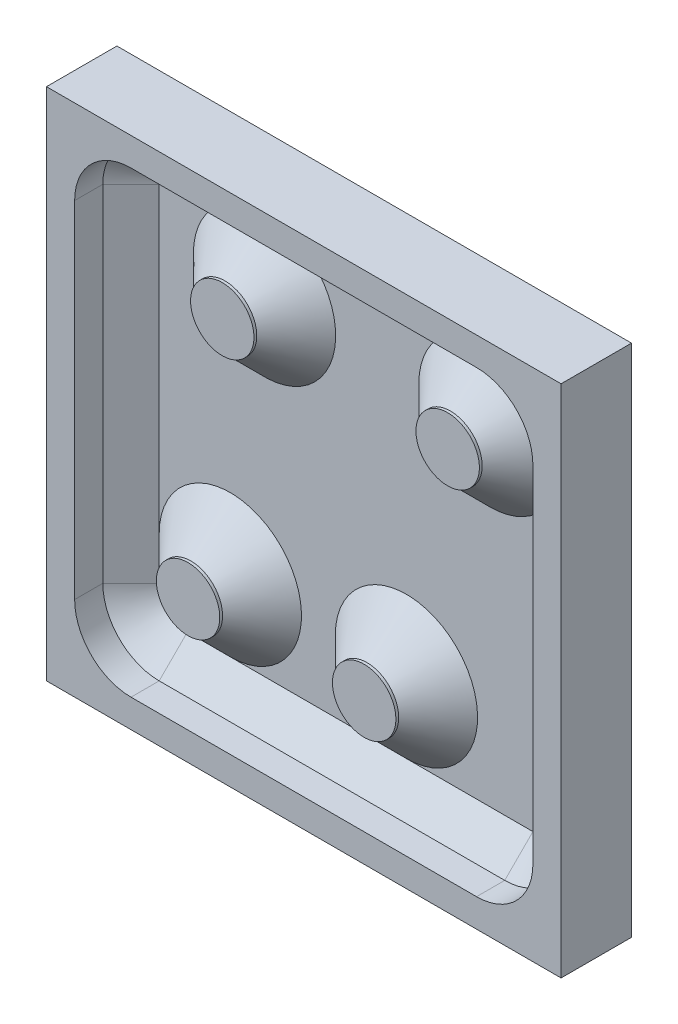
ISO-10303-21;
HEADER;
FILE_DESCRIPTION(('STEP AP214'),'2;1');
FILE_NAME('part.step','',(''),(''),'','','');
FILE_SCHEMA(('AUTOMOTIVE_DESIGN { 1 0 10303 214 1 1 1 1 }'));
ENDSEC;
DATA;
#1=APPLICATION_CONTEXT('core data for automotive mechanical design processes');
#2=APPLICATION_PROTOCOL_DEFINITION('international standard','automotive_design',2000,#1);
#3=PRODUCT_CONTEXT('',#1,'mechanical');
#4=PRODUCT('Part','Part','',(#3));
#5=PRODUCT_RELATED_PRODUCT_CATEGORY('part','',(#4));
#6=PRODUCT_DEFINITION_FORMATION('','',#4);
#7=PRODUCT_DEFINITION_CONTEXT('part definition',#1,'design');
#8=PRODUCT_DEFINITION('design','',#6,#7);
#9=PRODUCT_DEFINITION_SHAPE('','',#8);
#10=(LENGTH_UNIT() NAMED_UNIT(*) SI_UNIT(.MILLI.,.METRE.));
#11=(NAMED_UNIT(*) PLANE_ANGLE_UNIT() SI_UNIT($,.RADIAN.));
#12=(NAMED_UNIT(*) SI_UNIT($,.STERADIAN.) SOLID_ANGLE_UNIT());
#13=UNCERTAINTY_MEASURE_WITH_UNIT(LENGTH_MEASURE(1.E-05),#10,'distance_accuracy_value','');
#14=(GEOMETRIC_REPRESENTATION_CONTEXT(3) GLOBAL_UNCERTAINTY_ASSIGNED_CONTEXT((#13)) GLOBAL_UNIT_ASSIGNED_CONTEXT((#10,
#11,#12)) REPRESENTATION_CONTEXT('',''));
#15=CARTESIAN_POINT('',(0.,0.,0.));
#16=DIRECTION('',(0.,0.,1.));
#17=DIRECTION('',(1.,0.,0.));
#18=AXIS2_PLACEMENT_3D('',#15,#16,#17);
#19=CARTESIAN_POINT('',(-18.2634559672906,-18.2634559672906,-5.));
#20=DIRECTION('',(-1.,0.,0.));
#21=DIRECTION('',(0.,0.,1.));
#22=AXIS2_PLACEMENT_3D('',#19,#20,#21);
#23=PLANE('',#22);
#24=DIRECTION('',(0.,-1.,0.));
#25=VECTOR('',#24,1.);
#26=CARTESIAN_POINT('',(-18.2634559672906,-18.2634559672906,0.));
#27=LINE('',#26,#25);
#28=CARTESIAN_POINT('',(-18.2634559672906,18.2634559672906,0.));
#29=VERTEX_POINT('',#28);
#30=CARTESIAN_POINT('',(-18.2634559672906,-18.2634559672906,0.));
#31=VERTEX_POINT('',#30);
#32=EDGE_CURVE('E313',#29,#31,#27,.T.);
#33=ORIENTED_EDGE('',*,*,#32,.F.);
#34=DIRECTION('',(0.,0.,1.));
#35=VECTOR('',#34,1.);
#36=CARTESIAN_POINT('',(-18.2634559672906,18.2634559672906,-5.));
#37=LINE('',#36,#35);
#38=CARTESIAN_POINT('',(-18.2634559672906,18.2634559672906,-5.));
#39=VERTEX_POINT('',#38);
#40=EDGE_CURVE('E11',#39,#29,#37,.T.);
#41=ORIENTED_EDGE('',*,*,#40,.F.);
#42=DIRECTION('',(0.,-1.,0.));
#43=VECTOR('',#42,1.);
#44=CARTESIAN_POINT('',(-18.2634559672906,-18.2634559672906,-5.));
#45=LINE('',#44,#43);
#46=CARTESIAN_POINT('',(-18.2634559672906,-18.2634559672906,-5.));
#47=VERTEX_POINT('',#46);
#48=EDGE_CURVE('E314',#39,#47,#45,.T.);
#49=ORIENTED_EDGE('',*,*,#48,.T.);
#50=DIRECTION('',(0.,0.,1.));
#51=VECTOR('',#50,1.);
#52=CARTESIAN_POINT('',(-18.2634559672906,-18.2634559672906,-5.));
#53=LINE('',#52,#51);
#54=EDGE_CURVE('E38',#47,#31,#53,.T.);
#55=ORIENTED_EDGE('',*,*,#54,.T.);
#56=EDGE_LOOP('',(#33,#41,#49,#55));
#57=FACE_BOUND('',#56,.T.);
#58=ADVANCED_FACE('F35',(#57),#23,.T.);
#59=CARTESIAN_POINT('',(18.2634559672906,18.2634559672906,-5.));
#60=DIRECTION('',(0.,1.,0.));
#61=DIRECTION('',(0.,0.,1.));
#62=AXIS2_PLACEMENT_3D('',#59,#60,#61);
#63=PLANE('',#62);
#64=DIRECTION('',(-1.,0.,0.));
#65=VECTOR('',#64,1.);
#66=CARTESIAN_POINT('',(18.2634559672906,18.2634559672906,0.));
#67=LINE('',#66,#65);
#68=CARTESIAN_POINT('',(18.2634559672906,18.2634559672906,0.));
#69=VERTEX_POINT('',#68);
#70=EDGE_CURVE('E317',#69,#29,#67,.T.);
#71=ORIENTED_EDGE('',*,*,#70,.F.);
#72=DIRECTION('',(0.,0.,1.));
#73=VECTOR('',#72,1.);
#74=CARTESIAN_POINT('',(18.2634559672906,18.2634559672906,-5.));
#75=LINE('',#74,#73);
#76=CARTESIAN_POINT('',(18.2634559672906,18.2634559672906,-5.));
#77=VERTEX_POINT('',#76);
#78=EDGE_CURVE('E43',#77,#69,#75,.T.);
#79=ORIENTED_EDGE('',*,*,#78,.F.);
#80=DIRECTION('',(-1.,0.,0.));
#81=VECTOR('',#80,1.);
#82=CARTESIAN_POINT('',(18.2634559672906,18.2634559672906,-5.));
#83=LINE('',#82,#81);
#84=EDGE_CURVE('E322',#77,#39,#83,.T.);
#85=ORIENTED_EDGE('',*,*,#84,.T.);
#86=ORIENTED_EDGE('',*,*,#40,.T.);
#87=EDGE_LOOP('',(#71,#79,#85,#86));
#88=FACE_BOUND('',#87,.T.);
#89=ADVANCED_FACE('F337',(#88),#63,.T.);
#90=CARTESIAN_POINT('',(18.2634559672906,-18.2634559672906,-5.));
#91=DIRECTION('',(1.,0.,0.));
#92=DIRECTION('',(0.,0.,-1.));
#93=AXIS2_PLACEMENT_3D('',#90,#91,#92);
#94=PLANE('',#93);
#95=DIRECTION('',(0.,1.,0.));
#96=VECTOR('',#95,1.);
#97=CARTESIAN_POINT('',(18.2634559672906,-18.2634559672906,0.));
#98=LINE('',#97,#96);
#99=CARTESIAN_POINT('',(18.2634559672906,-18.2634559672906,0.));
#100=VERTEX_POINT('',#99);
#101=EDGE_CURVE('E329',#100,#69,#98,.T.);
#102=ORIENTED_EDGE('',*,*,#101,.F.);
#103=DIRECTION('',(0.,0.,1.));
#104=VECTOR('',#103,1.);
#105=CARTESIAN_POINT('',(18.2634559672906,-18.2634559672906,-5.));
#106=LINE('',#105,#104);
#107=CARTESIAN_POINT('',(18.2634559672906,-18.2634559672906,-5.));
#108=VERTEX_POINT('',#107);
#109=EDGE_CURVE('E334',#108,#100,#106,.T.);
#110=ORIENTED_EDGE('',*,*,#109,.F.);
#111=DIRECTION('',(0.,1.,0.));
#112=VECTOR('',#111,1.);
#113=CARTESIAN_POINT('',(18.2634559672906,-18.2634559672906,-5.));
#114=LINE('',#113,#112);
#115=EDGE_CURVE('E319',#108,#77,#114,.T.);
#116=ORIENTED_EDGE('',*,*,#115,.T.);
#117=ORIENTED_EDGE('',*,*,#78,.T.);
#118=EDGE_LOOP('',(#102,#110,#116,#117));
#119=FACE_BOUND('',#118,.T.);
#120=ADVANCED_FACE('F341',(#119),#94,.T.);
#121=CARTESIAN_POINT('',(18.2634559672906,-18.2634559672906,-5.));
#122=DIRECTION('',(0.,-1.,0.));
#123=DIRECTION('',(0.,0.,-1.));
#124=AXIS2_PLACEMENT_3D('',#121,#122,#123);
#125=PLANE('',#124);
#126=DIRECTION('',(1.,0.,0.));
#127=VECTOR('',#126,1.);
#128=CARTESIAN_POINT('',(18.2634559672906,-18.2634559672906,0.));
#129=LINE('',#128,#127);
#130=EDGE_CURVE('E326',#31,#100,#129,.T.);
#131=ORIENTED_EDGE('',*,*,#130,.F.);
#132=ORIENTED_EDGE('',*,*,#54,.F.);
#133=DIRECTION('',(1.,0.,0.));
#134=VECTOR('',#133,1.);
#135=CARTESIAN_POINT('',(18.2634559672906,-18.2634559672906,-5.));
#136=LINE('',#135,#134);
#137=EDGE_CURVE('E316',#47,#108,#136,.T.);
#138=ORIENTED_EDGE('',*,*,#137,.T.);
#139=ORIENTED_EDGE('',*,*,#109,.T.);
#140=EDGE_LOOP('',(#131,#132,#138,#139));
#141=FACE_BOUND('',#140,.T.);
#142=ADVANCED_FACE('F336',(#141),#125,.T.);
#143=CARTESIAN_POINT('',(0.,0.,-5.));
#144=DIRECTION('',(0.,0.,1.));
#145=DIRECTION('',(1.,0.,0.));
#146=AXIS2_PLACEMENT_3D('',#143,#144,#145);
#147=PLANE('',#146);
#148=ORIENTED_EDGE('',*,*,#48,.F.);
#149=ORIENTED_EDGE('',*,*,#84,.F.);
#150=ORIENTED_EDGE('',*,*,#115,.F.);
#151=ORIENTED_EDGE('',*,*,#137,.F.);
#152=EDGE_LOOP('',(#148,#149,#150,#151));
#153=FACE_BOUND('',#152,.T.);
#154=ADVANCED_FACE('F343',(#153),#147,.F.);
#155=CARTESIAN_POINT('',(0.,0.,0.));
#156=DIRECTION('',(0.,0.,1.));
#157=DIRECTION('',(1.,0.,0.));
#158=AXIS2_PLACEMENT_3D('',#155,#156,#157);
#159=PLANE('',#158);
#160=CARTESIAN_POINT('',(-12.2634559672906,-12.2634559672906,0.));
#161=DIRECTION('',(0.,0.,-1.));
#162=DIRECTION('',(-1.,0.,0.));
#163=AXIS2_PLACEMENT_3D('',#160,#161,#162);
#164=CIRCLE('',#163,4.);
#165=CARTESIAN_POINT('',(-16.2634559672906,-12.2634559672906,0.));
#166=VERTEX_POINT('',#165);
#167=CARTESIAN_POINT('',(-12.2634559672906,-16.2634559672906,0.));
#168=VERTEX_POINT('',#167);
#169=EDGE_CURVE('E201',#166,#168,#164,.F.);
#170=ORIENTED_EDGE('',*,*,#169,.F.);
#171=DIRECTION('',(0.,1.,0.));
#172=VECTOR('',#171,1.);
#173=CARTESIAN_POINT('',(-16.2634559672906,-16.2634559672906,0.));
#174=LINE('',#173,#172);
#175=CARTESIAN_POINT('',(-16.2634559672906,12.2634559672906,0.));
#176=VERTEX_POINT('',#175);
#177=EDGE_CURVE('E195',#166,#176,#174,.T.);
#178=ORIENTED_EDGE('',*,*,#177,.T.);
#179=CARTESIAN_POINT('',(-12.2634559672906,12.2634559672906,0.));
#180=DIRECTION('',(0.,0.,-1.));
#181=DIRECTION('',(-1.,0.,0.));
#182=AXIS2_PLACEMENT_3D('',#179,#180,#181);
#183=CIRCLE('',#182,4.);
#184=CARTESIAN_POINT('',(-12.2634559672906,16.2634559672906,0.));
#185=VERTEX_POINT('',#184);
#186=EDGE_CURVE('E205',#185,#176,#183,.F.);
#187=ORIENTED_EDGE('',*,*,#186,.F.);
#188=DIRECTION('',(1.,0.,0.));
#189=VECTOR('',#188,1.);
#190=CARTESIAN_POINT('',(-16.2634559672906,16.2634559672906,0.));
#191=LINE('',#190,#189);
#192=CARTESIAN_POINT('',(12.2634559672906,16.2634559672906,0.));
#193=VERTEX_POINT('',#192);
#194=EDGE_CURVE('E703',#185,#193,#191,.T.);
#195=ORIENTED_EDGE('',*,*,#194,.T.);
#196=CARTESIAN_POINT('',(12.2634559672906,12.2634559672906,0.));
#197=DIRECTION('',(0.,0.,-1.));
#198=DIRECTION('',(-1.,0.,0.));
#199=AXIS2_PLACEMENT_3D('',#196,#197,#198);
#200=CIRCLE('',#199,4.);
#201=CARTESIAN_POINT('',(16.2634559672906,12.2634559672906,0.));
#202=VERTEX_POINT('',#201);
#203=EDGE_CURVE('E185',#202,#193,#200,.F.);
#204=ORIENTED_EDGE('',*,*,#203,.F.);
#205=DIRECTION('',(0.,-1.,0.));
#206=VECTOR('',#205,1.);
#207=CARTESIAN_POINT('',(16.2634559672906,-16.2634559672906,0.));
#208=LINE('',#207,#206);
#209=CARTESIAN_POINT('',(16.2634559672906,-12.2634559672906,0.));
#210=VERTEX_POINT('',#209);
#211=EDGE_CURVE('E51',#202,#210,#208,.T.);
#212=ORIENTED_EDGE('',*,*,#211,.T.);
#213=CARTESIAN_POINT('',(12.2634559672906,-12.2634559672906,0.));
#214=DIRECTION('',(0.,0.,-1.));
#215=DIRECTION('',(-1.,0.,0.));
#216=AXIS2_PLACEMENT_3D('',#213,#214,#215);
#217=CIRCLE('',#216,4.);
#218=CARTESIAN_POINT('',(12.2634559672906,-16.2634559672906,0.));
#219=VERTEX_POINT('',#218);
#220=EDGE_CURVE('E180',#219,#210,#217,.F.);
#221=ORIENTED_EDGE('',*,*,#220,.F.);
#222=DIRECTION('',(-1.,0.,0.));
#223=VECTOR('',#222,1.);
#224=CARTESIAN_POINT('',(-16.2634559672906,-16.2634559672906,0.));
#225=LINE('',#224,#223);
#226=EDGE_CURVE('E190',#219,#168,#225,.T.);
#227=ORIENTED_EDGE('',*,*,#226,.T.);
#228=EDGE_LOOP('',(#170,#178,#187,#195,#204,#212,#221,#227));
#229=FACE_BOUND('',#228,.T.);
#230=ORIENTED_EDGE('',*,*,#32,.T.);
#231=ORIENTED_EDGE('',*,*,#130,.T.);
#232=ORIENTED_EDGE('',*,*,#101,.T.);
#233=ORIENTED_EDGE('',*,*,#70,.T.);
#234=EDGE_LOOP('',(#230,#231,#232,#233));
#235=FACE_BOUND('',#234,.T.);
#236=ADVANCED_FACE('F197',(#229,#235),#159,.T.);
#237=CARTESIAN_POINT('',(0.,0.,-4.));
#238=DIRECTION('',(0.,0.,-1.));
#239=DIRECTION('',(-1.,0.,0.));
#240=AXIS2_PLACEMENT_3D('',#237,#238,#239);
#241=PLANE('',#240);
#242=DIRECTION('',(0.,1.,0.));
#243=VECTOR('',#242,1.);
#244=CARTESIAN_POINT('',(-14.2634559672906,12.2634559672906,-4.));
#245=LINE('',#244,#243);
#246=CARTESIAN_POINT('',(-14.2634559672906,-12.2634559672906,-4.));
#247=VERTEX_POINT('',#246);
#248=CARTESIAN_POINT('',(-14.2634559672906,-9.21345596729061,-4.));
#249=VERTEX_POINT('',#248);
#250=EDGE_CURVE('E234',#247,#249,#245,.T.);
#251=ORIENTED_EDGE('',*,*,#250,.F.);
#252=CARTESIAN_POINT('',(-12.2634559672906,-12.2634559672906,-4.));
#253=DIRECTION('',(0.,0.,-1.));
#254=DIRECTION('',(-1.,0.,0.));
#255=AXIS2_PLACEMENT_3D('',#252,#253,#254);
#256=CIRCLE('',#255,2.00000000000001);
#257=CARTESIAN_POINT('',(-12.2634559672906,-14.2634559672906,-4.));
#258=VERTEX_POINT('',#257);
#259=EDGE_CURVE('E239',#258,#247,#256,.T.);
#260=ORIENTED_EDGE('',*,*,#259,.F.);
#261=DIRECTION('',(-1.,0.,0.));
#262=VECTOR('',#261,1.);
#263=CARTESIAN_POINT('',(-12.2634559672906,-14.2634559672906,-4.));
#264=LINE('',#263,#262);
#265=CARTESIAN_POINT('',(-9.21345596729061,-14.2634559672906,-4.));
#266=VERTEX_POINT('',#265);
#267=EDGE_CURVE('E241',#266,#258,#264,.T.);
#268=ORIENTED_EDGE('',*,*,#267,.F.);
#269=CARTESIAN_POINT('',(-9.21345596729061,-9.21345596729061,-4.));
#270=DIRECTION('',(0.,0.,-1.));
#271=DIRECTION('',(-1.,0.,0.));
#272=AXIS2_PLACEMENT_3D('',#269,#270,#271);
#273=CIRCLE('',#272,5.05000000000002);
#274=EDGE_CURVE('E295',#249,#266,#273,.F.);
#275=ORIENTED_EDGE('',*,*,#274,.F.);
#276=EDGE_LOOP('',(#251,#260,#268,#275));
#277=FACE_BOUND('',#276,.T.);
#278=ADVANCED_FACE('F350',(#277),#241,.F.);
#279=DIRECTION('',(0.,-1.,0.));
#280=VECTOR('',#279,1.);
#281=CARTESIAN_POINT('',(14.2634559672906,-12.2634559672906,-4.));
#282=LINE('',#281,#280);
#283=CARTESIAN_POINT('',(14.2634559672906,12.2634559672906,-4.));
#284=VERTEX_POINT('',#283);
#285=CARTESIAN_POINT('',(14.2634559672906,9.21345596729061,-4.));
#286=VERTEX_POINT('',#285);
#287=EDGE_CURVE('E230',#284,#286,#282,.T.);
#288=ORIENTED_EDGE('',*,*,#287,.F.);
#289=CARTESIAN_POINT('',(12.2634559672906,12.2634559672906,-4.));
#290=DIRECTION('',(0.,0.,-1.));
#291=DIRECTION('',(-1.,0.,0.));
#292=AXIS2_PLACEMENT_3D('',#289,#290,#291);
#293=CIRCLE('',#292,2.00000000000001);
#294=CARTESIAN_POINT('',(12.2634559672906,14.2634559672906,-4.));
#295=VERTEX_POINT('',#294);
#296=EDGE_CURVE('E224',#295,#284,#293,.T.);
#297=ORIENTED_EDGE('',*,*,#296,.F.);
#298=DIRECTION('',(1.,0.,0.));
#299=VECTOR('',#298,1.);
#300=CARTESIAN_POINT('',(12.2634559672906,14.2634559672906,-4.));
#301=LINE('',#300,#299);
#302=CARTESIAN_POINT('',(9.21345596729061,14.2634559672906,-4.));
#303=VERTEX_POINT('',#302);
#304=EDGE_CURVE('E220',#303,#295,#301,.T.);
#305=ORIENTED_EDGE('',*,*,#304,.F.);
#306=CARTESIAN_POINT('',(9.21345596729061,9.21345596729061,-4.));
#307=DIRECTION('',(0.,0.,-1.));
#308=DIRECTION('',(-1.,0.,0.));
#309=AXIS2_PLACEMENT_3D('',#306,#307,#308);
#310=CIRCLE('',#309,5.05000000000001);
#311=EDGE_CURVE('E290',#286,#303,#310,.F.);
#312=ORIENTED_EDGE('',*,*,#311,.F.);
#313=EDGE_LOOP('',(#288,#297,#305,#312));
#314=FACE_BOUND('',#313,.T.);
#315=ADVANCED_FACE('F387',(#314),#241,.F.);
#316=CARTESIAN_POINT('',(16.2634559672906,-16.2634559672906,-4.));
#317=DIRECTION('',(-1.,0.,0.));
#318=DIRECTION('',(0.,0.,1.));
#319=AXIS2_PLACEMENT_3D('',#316,#317,#318);
#320=PLANE('',#319);
#321=DIRECTION('',(0.,0.,1.));
#322=VECTOR('',#321,1.);
#323=CARTESIAN_POINT('',(16.2634559672906,-12.2634559672906,-4.));
#324=LINE('',#323,#322);
#325=CARTESIAN_POINT('',(16.2634559672906,-12.2634559672906,-2.));
#326=VERTEX_POINT('',#325);
#327=EDGE_CURVE('E203',#210,#326,#324,.F.);
#328=ORIENTED_EDGE('',*,*,#327,.F.);
#329=ORIENTED_EDGE('',*,*,#211,.F.);
#330=DIRECTION('',(0.,0.,1.));
#331=VECTOR('',#330,1.);
#332=CARTESIAN_POINT('',(16.2634559672906,12.2634559672906,-4.));
#333=LINE('',#332,#331);
#334=CARTESIAN_POINT('',(16.2634559672906,12.2634559672906,-2.));
#335=VERTEX_POINT('',#334);
#336=EDGE_CURVE('E200',#335,#202,#333,.T.);
#337=ORIENTED_EDGE('',*,*,#336,.F.);
#338=DIRECTION('',(0.,1.,0.));
#339=VECTOR('',#338,1.);
#340=CARTESIAN_POINT('',(16.2634559672906,12.2634559672906,-2.));
#341=LINE('',#340,#339);
#342=EDGE_CURVE('E253',#326,#335,#341,.T.);
#343=ORIENTED_EDGE('',*,*,#342,.F.);
#344=EDGE_LOOP('',(#328,#329,#337,#343));
#345=FACE_BOUND('',#344,.T.);
#346=ADVANCED_FACE('F398',(#345),#320,.T.);
#347=CARTESIAN_POINT('',(-16.2634559672906,-16.2634559672906,-4.));
#348=DIRECTION('',(0.,1.,0.));
#349=DIRECTION('',(1.,0.,0.));
#350=AXIS2_PLACEMENT_3D('',#347,#348,#349);
#351=PLANE('',#350);
#352=DIRECTION('',(0.,0.,1.));
#353=VECTOR('',#352,1.);
#354=CARTESIAN_POINT('',(-12.2634559672906,-16.2634559672906,-4.));
#355=LINE('',#354,#353);
#356=CARTESIAN_POINT('',(-12.2634559672906,-16.2634559672906,-2.));
#357=VERTEX_POINT('',#356);
#358=EDGE_CURVE('E186',#168,#357,#355,.F.);
#359=ORIENTED_EDGE('',*,*,#358,.F.);
#360=ORIENTED_EDGE('',*,*,#226,.F.);
#361=DIRECTION('',(0.,0.,1.));
#362=VECTOR('',#361,1.);
#363=CARTESIAN_POINT('',(12.2634559672906,-16.2634559672906,-4.));
#364=LINE('',#363,#362);
#365=CARTESIAN_POINT('',(12.2634559672906,-16.2634559672906,-2.));
#366=VERTEX_POINT('',#365);
#367=EDGE_CURVE('E175',#366,#219,#364,.T.);
#368=ORIENTED_EDGE('',*,*,#367,.F.);
#369=DIRECTION('',(1.,0.,0.));
#370=VECTOR('',#369,1.);
#371=CARTESIAN_POINT('',(12.2634559672906,-16.2634559672906,-2.));
#372=LINE('',#371,#370);
#373=EDGE_CURVE('E245',#357,#366,#372,.T.);
#374=ORIENTED_EDGE('',*,*,#373,.F.);
#375=EDGE_LOOP('',(#359,#360,#368,#374));
#376=FACE_BOUND('',#375,.T.);
#377=ADVANCED_FACE('F191',(#376),#351,.T.);
#378=CARTESIAN_POINT('',(-16.2634559672906,-16.2634559672906,-4.));
#379=DIRECTION('',(1.,0.,0.));
#380=DIRECTION('',(0.,0.,-1.));
#381=AXIS2_PLACEMENT_3D('',#378,#379,#380);
#382=PLANE('',#381);
#383=DIRECTION('',(0.,0.,1.));
#384=VECTOR('',#383,1.);
#385=CARTESIAN_POINT('',(-16.2634559672906,12.2634559672906,-4.));
#386=LINE('',#385,#384);
#387=CARTESIAN_POINT('',(-16.2634559672906,12.2634559672906,-2.));
#388=VERTEX_POINT('',#387);
#389=EDGE_CURVE('E210',#176,#388,#386,.F.);
#390=ORIENTED_EDGE('',*,*,#389,.F.);
#391=ORIENTED_EDGE('',*,*,#177,.F.);
#392=DIRECTION('',(0.,0.,1.));
#393=VECTOR('',#392,1.);
#394=CARTESIAN_POINT('',(-16.2634559672906,-12.2634559672906,-4.));
#395=LINE('',#394,#393);
#396=CARTESIAN_POINT('',(-16.2634559672906,-12.2634559672906,-2.));
#397=VERTEX_POINT('',#396);
#398=EDGE_CURVE('E213',#397,#166,#395,.T.);
#399=ORIENTED_EDGE('',*,*,#398,.F.);
#400=DIRECTION('',(0.,-1.,0.));
#401=VECTOR('',#400,1.);
#402=CARTESIAN_POINT('',(-16.2634559672906,-12.2634559672906,-2.));
#403=LINE('',#402,#401);
#404=EDGE_CURVE('E251',#388,#397,#403,.T.);
#405=ORIENTED_EDGE('',*,*,#404,.F.);
#406=EDGE_LOOP('',(#390,#391,#399,#405));
#407=FACE_BOUND('',#406,.T.);
#408=ADVANCED_FACE('F415',(#407),#382,.T.);
#409=CARTESIAN_POINT('',(-16.2634559672906,16.2634559672906,-4.));
#410=DIRECTION('',(0.,-1.,0.));
#411=DIRECTION('',(-1.,0.,0.));
#412=AXIS2_PLACEMENT_3D('',#409,#410,#411);
#413=PLANE('',#412);
#414=DIRECTION('',(0.,0.,1.));
#415=VECTOR('',#414,1.);
#416=CARTESIAN_POINT('',(12.2634559672906,16.2634559672906,-4.));
#417=LINE('',#416,#415);
#418=CARTESIAN_POINT('',(12.2634559672906,16.2634559672906,-2.));
#419=VERTEX_POINT('',#418);
#420=EDGE_CURVE('E215',#193,#419,#417,.F.);
#421=ORIENTED_EDGE('',*,*,#420,.F.);
#422=ORIENTED_EDGE('',*,*,#194,.F.);
#423=DIRECTION('',(0.,0.,1.));
#424=VECTOR('',#423,1.);
#425=CARTESIAN_POINT('',(-12.2634559672906,16.2634559672906,-4.));
#426=LINE('',#425,#424);
#427=CARTESIAN_POINT('',(-12.2634559672906,16.2634559672906,-2.));
#428=VERTEX_POINT('',#427);
#429=EDGE_CURVE('E218',#428,#185,#426,.T.);
#430=ORIENTED_EDGE('',*,*,#429,.F.);
#431=DIRECTION('',(-1.,0.,0.));
#432=VECTOR('',#431,1.);
#433=CARTESIAN_POINT('',(-12.2634559672906,16.2634559672906,-2.));
#434=LINE('',#433,#432);
#435=EDGE_CURVE('E259',#419,#428,#434,.T.);
#436=ORIENTED_EDGE('',*,*,#435,.F.);
#437=EDGE_LOOP('',(#421,#422,#430,#436));
#438=FACE_BOUND('',#437,.T.);
#439=ADVANCED_FACE('F424',(#438),#413,.T.);
#440=CARTESIAN_POINT('',(-12.2634559672906,14.2634559672906,-4.));
#441=VERTEX_POINT('',#440);
#442=CARTESIAN_POINT('',(-6.78654403270939,14.2634559672906,-4.));
#443=VERTEX_POINT('',#442);
#444=EDGE_CURVE('E221',#441,#443,#301,.T.);
#445=ORIENTED_EDGE('',*,*,#444,.F.);
#446=CARTESIAN_POINT('',(-12.2634559672906,12.2634559672906,-4.));
#447=DIRECTION('',(0.,0.,-1.));
#448=DIRECTION('',(-1.,0.,0.));
#449=AXIS2_PLACEMENT_3D('',#446,#447,#448);
#450=CIRCLE('',#449,2.00000000000001);
#451=CARTESIAN_POINT('',(-14.2634559672906,12.2634559672906,-4.));
#452=VERTEX_POINT('',#451);
#453=EDGE_CURVE('E227',#452,#441,#450,.T.);
#454=ORIENTED_EDGE('',*,*,#453,.F.);
#455=EDGE_CURVE('E233',#249,#452,#245,.T.);
#456=ORIENTED_EDGE('',*,*,#455,.F.);
#457=CARTESIAN_POINT('',(-9.21345596729061,-9.21345596729061,-4.));
#458=DIRECTION('',(0.,0.,-1.));
#459=DIRECTION('',(-1.,0.,0.));
#460=AXIS2_PLACEMENT_3D('',#457,#458,#459);
#461=CIRCLE('',#460,5.05000000000002);
#462=EDGE_CURVE('E293',#266,#249,#461,.F.);
#463=ORIENTED_EDGE('',*,*,#462,.F.);
#464=CARTESIAN_POINT('',(3.28654403270939,-14.2634559672906,-4.));
#465=VERTEX_POINT('',#464);
#466=EDGE_CURVE('E246',#465,#266,#264,.T.);
#467=ORIENTED_EDGE('',*,*,#466,.F.);
#468=CARTESIAN_POINT('',(3.28654403270939,-9.21345596729061,-4.));
#469=DIRECTION('',(0.,0.,-1.));
#470=DIRECTION('',(-1.,0.,0.));
#471=AXIS2_PLACEMENT_3D('',#468,#469,#470);
#472=CIRCLE('',#471,5.05000000000001);
#473=EDGE_CURVE('E298',#465,#465,#472,.F.);
#474=ORIENTED_EDGE('',*,*,#473,.F.);
#475=CARTESIAN_POINT('',(12.2634559672906,-14.2634559672906,-4.));
#476=VERTEX_POINT('',#475);
#477=EDGE_CURVE('E242',#476,#465,#264,.T.);
#478=ORIENTED_EDGE('',*,*,#477,.F.);
#479=CARTESIAN_POINT('',(12.2634559672906,-12.2634559672906,-4.));
#480=DIRECTION('',(0.,0.,-1.));
#481=DIRECTION('',(-1.,0.,0.));
#482=AXIS2_PLACEMENT_3D('',#479,#480,#481);
#483=CIRCLE('',#482,2.00000000000001);
#484=CARTESIAN_POINT('',(14.2634559672906,-12.2634559672906,-4.));
#485=VERTEX_POINT('',#484);
#486=EDGE_CURVE('E237',#485,#476,#483,.T.);
#487=ORIENTED_EDGE('',*,*,#486,.F.);
#488=EDGE_CURVE('E229',#286,#485,#282,.T.);
#489=ORIENTED_EDGE('',*,*,#488,.F.);
#490=CARTESIAN_POINT('',(9.21345596729061,9.21345596729061,-4.));
#491=DIRECTION('',(0.,0.,-1.));
#492=DIRECTION('',(-1.,0.,0.));
#493=AXIS2_PLACEMENT_3D('',#490,#491,#492);
#494=CIRCLE('',#493,5.05000000000001);
#495=EDGE_CURVE('E288',#303,#286,#494,.F.);
#496=ORIENTED_EDGE('',*,*,#495,.F.);
#497=EDGE_CURVE('E225',#443,#303,#301,.T.);
#498=ORIENTED_EDGE('',*,*,#497,.F.);
#499=CARTESIAN_POINT('',(-6.78654403270939,9.21345596729061,-4.));
#500=DIRECTION('',(0.,0.,-1.));
#501=DIRECTION('',(-1.,0.,0.));
#502=AXIS2_PLACEMENT_3D('',#499,#500,#501);
#503=CIRCLE('',#502,5.05000000000001);
#504=EDGE_CURVE('E301',#443,#443,#503,.F.);
#505=ORIENTED_EDGE('',*,*,#504,.F.);
#506=EDGE_LOOP('',(#445,#454,#456,#463,#467,#474,#478,#487,#489,#496,#498,#505));
#507=FACE_BOUND('',#506,.T.);
#508=ADVANCED_FACE('F390',(#507),#241,.F.);
#509=CARTESIAN_POINT('',(12.2634559672906,-12.2634559672906,-4.));
#510=DIRECTION('',(0.,0.,1.));
#511=DIRECTION('',(1.,0.,0.));
#512=AXIS2_PLACEMENT_3D('',#509,#510,#511);
#513=CYLINDRICAL_SURFACE('',#512,4.);
#514=ORIENTED_EDGE('',*,*,#367,.T.);
#515=ORIENTED_EDGE('',*,*,#220,.T.);
#516=ORIENTED_EDGE('',*,*,#327,.T.);
#517=CARTESIAN_POINT('',(12.2634559672906,-12.2634559672906,-2.));
#518=DIRECTION('',(0.,0.,-1.));
#519=DIRECTION('',(-1.,0.,0.));
#520=AXIS2_PLACEMENT_3D('',#517,#518,#519);
#521=CIRCLE('',#520,4.);
#522=EDGE_CURVE('E181',#366,#326,#521,.F.);
#523=ORIENTED_EDGE('',*,*,#522,.F.);
#524=EDGE_LOOP('',(#514,#515,#516,#523));
#525=FACE_BOUND('',#524,.T.);
#526=ADVANCED_FACE('F177',(#525),#513,.F.);
#527=CARTESIAN_POINT('',(-12.2634559672906,-12.2634559672906,-4.));
#528=DIRECTION('',(0.,0.,1.));
#529=DIRECTION('',(1.,0.,0.));
#530=AXIS2_PLACEMENT_3D('',#527,#528,#529);
#531=CYLINDRICAL_SURFACE('',#530,4.);
#532=ORIENTED_EDGE('',*,*,#398,.T.);
#533=ORIENTED_EDGE('',*,*,#169,.T.);
#534=ORIENTED_EDGE('',*,*,#358,.T.);
#535=CARTESIAN_POINT('',(-12.2634559672906,-12.2634559672906,-2.));
#536=DIRECTION('',(0.,0.,-1.));
#537=DIRECTION('',(-1.,0.,0.));
#538=AXIS2_PLACEMENT_3D('',#535,#536,#537);
#539=CIRCLE('',#538,4.);
#540=EDGE_CURVE('E248',#397,#357,#539,.F.);
#541=ORIENTED_EDGE('',*,*,#540,.F.);
#542=EDGE_LOOP('',(#532,#533,#534,#541));
#543=FACE_BOUND('',#542,.T.);
#544=ADVANCED_FACE('F451',(#543),#531,.F.);
#545=CARTESIAN_POINT('',(-12.2634559672906,12.2634559672906,-4.));
#546=DIRECTION('',(0.,0.,1.));
#547=DIRECTION('',(1.,0.,0.));
#548=AXIS2_PLACEMENT_3D('',#545,#546,#547);
#549=CYLINDRICAL_SURFACE('',#548,4.);
#550=ORIENTED_EDGE('',*,*,#429,.T.);
#551=ORIENTED_EDGE('',*,*,#186,.T.);
#552=ORIENTED_EDGE('',*,*,#389,.T.);
#553=CARTESIAN_POINT('',(-12.2634559672906,12.2634559672906,-2.));
#554=DIRECTION('',(0.,0.,-1.));
#555=DIRECTION('',(-1.,0.,0.));
#556=AXIS2_PLACEMENT_3D('',#553,#554,#555);
#557=CIRCLE('',#556,4.);
#558=EDGE_CURVE('E255',#428,#388,#557,.F.);
#559=ORIENTED_EDGE('',*,*,#558,.F.);
#560=EDGE_LOOP('',(#550,#551,#552,#559));
#561=FACE_BOUND('',#560,.T.);
#562=ADVANCED_FACE('F460',(#561),#549,.F.);
#563=CARTESIAN_POINT('',(12.2634559672906,12.2634559672906,-4.));
#564=DIRECTION('',(0.,0.,1.));
#565=DIRECTION('',(1.,0.,0.));
#566=AXIS2_PLACEMENT_3D('',#563,#564,#565);
#567=CYLINDRICAL_SURFACE('',#566,4.);
#568=ORIENTED_EDGE('',*,*,#336,.T.);
#569=ORIENTED_EDGE('',*,*,#203,.T.);
#570=ORIENTED_EDGE('',*,*,#420,.T.);
#571=CARTESIAN_POINT('',(12.2634559672906,12.2634559672906,-2.));
#572=DIRECTION('',(0.,0.,-1.));
#573=DIRECTION('',(-1.,0.,0.));
#574=AXIS2_PLACEMENT_3D('',#571,#572,#573);
#575=CIRCLE('',#574,4.);
#576=EDGE_CURVE('E257',#335,#419,#575,.F.);
#577=ORIENTED_EDGE('',*,*,#576,.F.);
#578=EDGE_LOOP('',(#568,#569,#570,#577));
#579=FACE_BOUND('',#578,.T.);
#580=ADVANCED_FACE('F470',(#579),#567,.F.);
#581=CARTESIAN_POINT('',(0.,14.2634559672906,-4.));
#582=DIRECTION('',(0.,0.70710678118655,-0.707106781186545));
#583=DIRECTION('',(-1.,0.,0.));
#584=AXIS2_PLACEMENT_3D('',#581,#582,#583);
#585=PLANE('',#584);
#586=DIRECTION('',(0.,-0.707106781186545,-0.70710678118655));
#587=VECTOR('',#586,1.);
#588=CARTESIAN_POINT('',(-12.2634559672906,16.2634559672906,-2.));
#589=LINE('',#588,#587);
#590=EDGE_CURVE('E280',#428,#441,#589,.T.);
#591=ORIENTED_EDGE('',*,*,#590,.T.);
#592=ORIENTED_EDGE('',*,*,#444,.T.);
#593=ORIENTED_EDGE('',*,*,#497,.T.);
#594=ORIENTED_EDGE('',*,*,#304,.T.);
#595=DIRECTION('',(0.,0.707106781186545,0.70710678118655));
#596=VECTOR('',#595,1.);
#597=CARTESIAN_POINT('',(12.2634559672906,14.2634559672906,-4.));
#598=LINE('',#597,#596);
#599=EDGE_CURVE('E283',#295,#419,#598,.T.);
#600=ORIENTED_EDGE('',*,*,#599,.T.);
#601=ORIENTED_EDGE('',*,*,#435,.T.);
#602=EDGE_LOOP('',(#591,#592,#593,#594,#600,#601));
#603=FACE_BOUND('',#602,.T.);
#604=ADVANCED_FACE('F480',(#603),#585,.F.);
#605=CARTESIAN_POINT('',(12.2634559672906,12.2634559672906,-4.));
#606=DIRECTION('',(0.,0.,1.));
#607=DIRECTION('',(1.,0.,0.));
#608=AXIS2_PLACEMENT_3D('',#605,#606,#607);
#609=CONICAL_SURFACE('',#608,2.00000000000001,0.785398163397445);
#610=ORIENTED_EDGE('',*,*,#599,.F.);
#611=ORIENTED_EDGE('',*,*,#296,.T.);
#612=DIRECTION('',(0.707106781186545,0.,0.70710678118655));
#613=VECTOR('',#612,1.);
#614=CARTESIAN_POINT('',(14.2634559672906,12.2634559672906,-4.));
#615=LINE('',#614,#613);
#616=EDGE_CURVE('E277',#284,#335,#615,.T.);
#617=ORIENTED_EDGE('',*,*,#616,.T.);
#618=ORIENTED_EDGE('',*,*,#576,.T.);
#619=EDGE_LOOP('',(#610,#611,#617,#618));
#620=FACE_BOUND('',#619,.T.);
#621=ADVANCED_FACE('F490',(#620),#609,.F.);
#622=CARTESIAN_POINT('',(-12.2634559672906,12.2634559672906,-4.));
#623=DIRECTION('',(0.,0.,1.));
#624=DIRECTION('',(1.,0.,0.));
#625=AXIS2_PLACEMENT_3D('',#622,#623,#624);
#626=CONICAL_SURFACE('',#625,2.00000000000001,0.785398163397445);
#627=ORIENTED_EDGE('',*,*,#590,.F.);
#628=ORIENTED_EDGE('',*,*,#558,.T.);
#629=DIRECTION('',(0.707106781186545,0.,-0.70710678118655));
#630=VECTOR('',#629,1.);
#631=CARTESIAN_POINT('',(-16.2634559672906,12.2634559672906,-2.));
#632=LINE('',#631,#630);
#633=EDGE_CURVE('E274',#388,#452,#632,.T.);
#634=ORIENTED_EDGE('',*,*,#633,.T.);
#635=ORIENTED_EDGE('',*,*,#453,.T.);
#636=EDGE_LOOP('',(#627,#628,#634,#635));
#637=FACE_BOUND('',#636,.T.);
#638=ADVANCED_FACE('F500',(#637),#626,.F.);
#639=CARTESIAN_POINT('',(14.2634559672906,0.,-4.));
#640=DIRECTION('',(0.70710678118655,0.,-0.707106781186545));
#641=DIRECTION('',(0.,1.,0.));
#642=AXIS2_PLACEMENT_3D('',#639,#640,#641);
#643=PLANE('',#642);
#644=ORIENTED_EDGE('',*,*,#616,.F.);
#645=ORIENTED_EDGE('',*,*,#287,.T.);
#646=ORIENTED_EDGE('',*,*,#488,.T.);
#647=DIRECTION('',(0.707106781186545,0.,0.70710678118655));
#648=VECTOR('',#647,1.);
#649=CARTESIAN_POINT('',(14.2634559672906,-12.2634559672906,-4.));
#650=LINE('',#649,#648);
#651=EDGE_CURVE('E271',#485,#326,#650,.T.);
#652=ORIENTED_EDGE('',*,*,#651,.T.);
#653=ORIENTED_EDGE('',*,*,#342,.T.);
#654=EDGE_LOOP('',(#644,#645,#646,#652,#653));
#655=FACE_BOUND('',#654,.T.);
#656=ADVANCED_FACE('F510',(#655),#643,.F.);
#657=CARTESIAN_POINT('',(-14.2634559672906,0.,-4.));
#658=DIRECTION('',(-0.70710678118655,0.,-0.707106781186545));
#659=DIRECTION('',(0.,-1.,0.));
#660=AXIS2_PLACEMENT_3D('',#657,#658,#659);
#661=PLANE('',#660);
#662=ORIENTED_EDGE('',*,*,#633,.F.);
#663=ORIENTED_EDGE('',*,*,#404,.T.);
#664=DIRECTION('',(0.707106781186545,0.,-0.70710678118655));
#665=VECTOR('',#664,1.);
#666=CARTESIAN_POINT('',(-16.2634559672906,-12.2634559672906,-2.));
#667=LINE('',#666,#665);
#668=EDGE_CURVE('E268',#397,#247,#667,.T.);
#669=ORIENTED_EDGE('',*,*,#668,.T.);
#670=ORIENTED_EDGE('',*,*,#250,.T.);
#671=ORIENTED_EDGE('',*,*,#455,.T.);
#672=EDGE_LOOP('',(#662,#663,#669,#670,#671));
#673=FACE_BOUND('',#672,.T.);
#674=ADVANCED_FACE('F520',(#673),#661,.F.);
#675=CARTESIAN_POINT('',(12.2634559672906,-12.2634559672906,-4.));
#676=DIRECTION('',(0.,0.,1.));
#677=DIRECTION('',(1.,0.,0.));
#678=AXIS2_PLACEMENT_3D('',#675,#676,#677);
#679=CONICAL_SURFACE('',#678,2.00000000000001,0.785398163397445);
#680=ORIENTED_EDGE('',*,*,#651,.F.);
#681=ORIENTED_EDGE('',*,*,#486,.T.);
#682=DIRECTION('',(0.,-0.707106781186545,0.70710678118655));
#683=VECTOR('',#682,1.);
#684=CARTESIAN_POINT('',(12.2634559672906,-14.2634559672906,-4.));
#685=LINE('',#684,#683);
#686=EDGE_CURVE('E265',#476,#366,#685,.T.);
#687=ORIENTED_EDGE('',*,*,#686,.T.);
#688=ORIENTED_EDGE('',*,*,#522,.T.);
#689=EDGE_LOOP('',(#680,#681,#687,#688));
#690=FACE_BOUND('',#689,.T.);
#691=ADVANCED_FACE('F530',(#690),#679,.F.);
#692=CARTESIAN_POINT('',(-12.2634559672906,-12.2634559672906,-4.));
#693=DIRECTION('',(0.,0.,1.));
#694=DIRECTION('',(1.,0.,0.));
#695=AXIS2_PLACEMENT_3D('',#692,#693,#694);
#696=CONICAL_SURFACE('',#695,2.00000000000001,0.785398163397445);
#697=ORIENTED_EDGE('',*,*,#668,.F.);
#698=ORIENTED_EDGE('',*,*,#540,.T.);
#699=DIRECTION('',(0.,0.707106781186545,-0.70710678118655));
#700=VECTOR('',#699,1.);
#701=CARTESIAN_POINT('',(-12.2634559672906,-16.2634559672906,-2.));
#702=LINE('',#701,#700);
#703=EDGE_CURVE('E262',#357,#258,#702,.T.);
#704=ORIENTED_EDGE('',*,*,#703,.T.);
#705=ORIENTED_EDGE('',*,*,#259,.T.);
#706=EDGE_LOOP('',(#697,#698,#704,#705));
#707=FACE_BOUND('',#706,.T.);
#708=ADVANCED_FACE('F540',(#707),#696,.F.);
#709=CARTESIAN_POINT('',(0.,-14.2634559672906,-4.));
#710=DIRECTION('',(0.,-0.70710678118655,-0.707106781186545));
#711=DIRECTION('',(1.,0.,0.));
#712=AXIS2_PLACEMENT_3D('',#709,#710,#711);
#713=PLANE('',#712);
#714=ORIENTED_EDGE('',*,*,#686,.F.);
#715=ORIENTED_EDGE('',*,*,#477,.T.);
#716=ORIENTED_EDGE('',*,*,#466,.T.);
#717=ORIENTED_EDGE('',*,*,#267,.T.);
#718=ORIENTED_EDGE('',*,*,#703,.F.);
#719=ORIENTED_EDGE('',*,*,#373,.T.);
#720=EDGE_LOOP('',(#714,#715,#716,#717,#718,#719));
#721=FACE_BOUND('',#720,.T.);
#722=ADVANCED_FACE('F550',(#721),#713,.F.);
#723=CARTESIAN_POINT('',(-6.78654403270939,9.21345596729061,-1.));
#724=DIRECTION('',(0.,0.,-1.));
#725=DIRECTION('',(-1.,0.,0.));
#726=AXIS2_PLACEMENT_3D('',#723,#724,#725);
#727=CYLINDRICAL_SURFACE('',#726,2.25);
#728=CARTESIAN_POINT('',(-6.78654403270939,9.21345596729061,-1.2));
#729=DIRECTION('',(0.,0.,-1.));
#730=DIRECTION('',(-1.,0.,0.));
#731=AXIS2_PLACEMENT_3D('',#728,#729,#730);
#732=CIRCLE('',#731,2.25);
#733=CARTESIAN_POINT('',(-9.0365440327094,9.21345596729061,-1.2));
#734=VERTEX_POINT('',#733);
#735=EDGE_CURVE('E261',#734,#734,#732,.T.);
#736=ORIENTED_EDGE('',*,*,#735,.F.);
#737=EDGE_LOOP('',(#736));
#738=FACE_BOUND('',#737,.T.);
#739=CARTESIAN_POINT('',(-6.78654403270939,9.21345596729061,-1.));
#740=DIRECTION('',(0.,0.,-1.));
#741=DIRECTION('',(-1.,0.,0.));
#742=AXIS2_PLACEMENT_3D('',#739,#740,#741);
#743=CIRCLE('',#742,2.25);
#744=CARTESIAN_POINT('',(-9.0365440327094,9.21345596729061,-1.));
#745=VERTEX_POINT('',#744);
#746=EDGE_CURVE('E697',#745,#745,#743,.T.);
#747=ORIENTED_EDGE('',*,*,#746,.T.);
#748=EDGE_LOOP('',(#747));
#749=FACE_BOUND('',#748,.T.);
#750=ADVANCED_FACE('F560',(#738,#749),#727,.T.);
#751=CARTESIAN_POINT('',(-6.78654403270939,9.21345596729061,-1.));
#752=DIRECTION('',(0.,0.,-1.));
#753=DIRECTION('',(-1.,0.,0.));
#754=AXIS2_PLACEMENT_3D('',#751,#752,#753);
#755=PLANE('',#754);
#756=ORIENTED_EDGE('',*,*,#746,.F.);
#757=EDGE_LOOP('',(#756));
#758=FACE_BOUND('',#757,.T.);
#759=ADVANCED_FACE('F570',(#758),#755,.F.);
#760=CARTESIAN_POINT('',(3.28654403270939,-9.21345596729061,-1.));
#761=DIRECTION('',(0.,0.,-1.));
#762=DIRECTION('',(-1.,0.,0.));
#763=AXIS2_PLACEMENT_3D('',#760,#761,#762);
#764=CYLINDRICAL_SURFACE('',#763,2.25);
#765=CARTESIAN_POINT('',(3.28654403270939,-9.21345596729061,-1.2));
#766=DIRECTION('',(0.,0.,-1.));
#767=DIRECTION('',(-1.,0.,0.));
#768=AXIS2_PLACEMENT_3D('',#765,#766,#767);
#769=CIRCLE('',#768,2.25);
#770=CARTESIAN_POINT('',(1.03654403270939,-9.21345596729061,-1.2));
#771=VERTEX_POINT('',#770);
#772=EDGE_CURVE('E304',#771,#771,#769,.T.);
#773=ORIENTED_EDGE('',*,*,#772,.F.);
#774=EDGE_LOOP('',(#773));
#775=FACE_BOUND('',#774,.T.);
#776=CARTESIAN_POINT('',(3.28654403270939,-9.21345596729061,-1.));
#777=DIRECTION('',(0.,0.,-1.));
#778=DIRECTION('',(-1.,0.,0.));
#779=AXIS2_PLACEMENT_3D('',#776,#777,#778);
#780=CIRCLE('',#779,2.25);
#781=CARTESIAN_POINT('',(1.03654403270939,-9.21345596729061,-1.));
#782=VERTEX_POINT('',#781);
#783=EDGE_CURVE('E692',#782,#782,#780,.T.);
#784=ORIENTED_EDGE('',*,*,#783,.T.);
#785=EDGE_LOOP('',(#784));
#786=FACE_BOUND('',#785,.T.);
#787=ADVANCED_FACE('F580',(#775,#786),#764,.T.);
#788=CARTESIAN_POINT('',(3.28654403270939,-9.21345596729061,-1.));
#789=DIRECTION('',(0.,0.,-1.));
#790=DIRECTION('',(-1.,0.,0.));
#791=AXIS2_PLACEMENT_3D('',#788,#789,#790);
#792=PLANE('',#791);
#793=ORIENTED_EDGE('',*,*,#783,.F.);
#794=EDGE_LOOP('',(#793));
#795=FACE_BOUND('',#794,.T.);
#796=ADVANCED_FACE('F590',(#795),#792,.F.);
#797=CARTESIAN_POINT('',(-9.21345596729061,-9.21345596729061,-1.));
#798=DIRECTION('',(0.,0.,-1.));
#799=DIRECTION('',(-1.,0.,0.));
#800=AXIS2_PLACEMENT_3D('',#797,#798,#799);
#801=CYLINDRICAL_SURFACE('',#800,2.25);
#802=CARTESIAN_POINT('',(-9.21345596729061,-9.21345596729061,-1.19999999999999));
#803=DIRECTION('',(0.,0.,-1.));
#804=DIRECTION('',(-1.,0.,0.));
#805=AXIS2_PLACEMENT_3D('',#802,#803,#804);
#806=CIRCLE('',#805,2.25);
#807=CARTESIAN_POINT('',(-11.4634559672906,-9.21345596729061,-1.19999999999999));
#808=VERTEX_POINT('',#807);
#809=EDGE_CURVE('E307',#808,#808,#806,.T.);
#810=ORIENTED_EDGE('',*,*,#809,.F.);
#811=EDGE_LOOP('',(#810));
#812=FACE_BOUND('',#811,.T.);
#813=CARTESIAN_POINT('',(-9.21345596729061,-9.21345596729061,-1.));
#814=DIRECTION('',(0.,0.,-1.));
#815=DIRECTION('',(-1.,0.,0.));
#816=AXIS2_PLACEMENT_3D('',#813,#814,#815);
#817=CIRCLE('',#816,2.25);
#818=CARTESIAN_POINT('',(-11.4634559672906,-9.21345596729061,-1.));
#819=VERTEX_POINT('',#818);
#820=EDGE_CURVE('E689',#819,#819,#817,.T.);
#821=ORIENTED_EDGE('',*,*,#820,.T.);
#822=EDGE_LOOP('',(#821));
#823=FACE_BOUND('',#822,.T.);
#824=ADVANCED_FACE('F600',(#812,#823),#801,.T.);
#825=CARTESIAN_POINT('',(-9.21345596729061,-9.21345596729061,-1.));
#826=DIRECTION('',(0.,0.,-1.));
#827=DIRECTION('',(-1.,0.,0.));
#828=AXIS2_PLACEMENT_3D('',#825,#826,#827);
#829=PLANE('',#828);
#830=ORIENTED_EDGE('',*,*,#820,.F.);
#831=EDGE_LOOP('',(#830));
#832=FACE_BOUND('',#831,.T.);
#833=ADVANCED_FACE('F610',(#832),#829,.F.);
#834=CARTESIAN_POINT('',(9.21345596729061,9.21345596729061,-1.));
#835=DIRECTION('',(0.,0.,-1.));
#836=DIRECTION('',(-1.,0.,0.));
#837=AXIS2_PLACEMENT_3D('',#834,#835,#836);
#838=CYLINDRICAL_SURFACE('',#837,2.25);
#839=CARTESIAN_POINT('',(9.21345596729061,9.21345596729061,-1.2));
#840=DIRECTION('',(0.,0.,-1.));
#841=DIRECTION('',(-1.,0.,0.));
#842=AXIS2_PLACEMENT_3D('',#839,#840,#841);
#843=CIRCLE('',#842,2.25);
#844=CARTESIAN_POINT('',(6.96345596729061,9.21345596729061,-1.2));
#845=VERTEX_POINT('',#844);
#846=EDGE_CURVE('E310',#845,#845,#843,.T.);
#847=ORIENTED_EDGE('',*,*,#846,.F.);
#848=EDGE_LOOP('',(#847));
#849=FACE_BOUND('',#848,.T.);
#850=CARTESIAN_POINT('',(9.21345596729061,9.21345596729061,-1.));
#851=DIRECTION('',(0.,0.,-1.));
#852=DIRECTION('',(-1.,0.,0.));
#853=AXIS2_PLACEMENT_3D('',#850,#851,#852);
#854=CIRCLE('',#853,2.25);
#855=CARTESIAN_POINT('',(6.96345596729061,9.21345596729061,-1.));
#856=VERTEX_POINT('',#855);
#857=EDGE_CURVE('E266',#856,#856,#854,.T.);
#858=ORIENTED_EDGE('',*,*,#857,.T.);
#859=EDGE_LOOP('',(#858));
#860=FACE_BOUND('',#859,.T.);
#861=ADVANCED_FACE('F620',(#849,#860),#838,.T.);
#862=CARTESIAN_POINT('',(9.21345596729061,9.21345596729061,-1.));
#863=DIRECTION('',(0.,0.,-1.));
#864=DIRECTION('',(-1.,0.,0.));
#865=AXIS2_PLACEMENT_3D('',#862,#863,#864);
#866=PLANE('',#865);
#867=ORIENTED_EDGE('',*,*,#857,.F.);
#868=EDGE_LOOP('',(#867));
#869=FACE_BOUND('',#868,.T.);
#870=ADVANCED_FACE('F630',(#869),#866,.F.);
#871=CARTESIAN_POINT('',(-6.78654403270939,9.21345596729061,-1.2));
#872=DIRECTION('',(0.,0.,-1.));
#873=DIRECTION('',(-1.,0.,0.));
#874=AXIS2_PLACEMENT_3D('',#871,#872,#873);
#875=CONICAL_SURFACE('',#874,2.25,0.785398163397451);
#876=ORIENTED_EDGE('',*,*,#504,.T.);
#877=EDGE_LOOP('',(#876));
#878=FACE_BOUND('',#877,.T.);
#879=ORIENTED_EDGE('',*,*,#735,.T.);
#880=EDGE_LOOP('',(#879));
#881=FACE_BOUND('',#880,.T.);
#882=ADVANCED_FACE('F640',(#878,#881),#875,.T.);
#883=CARTESIAN_POINT('',(3.28654403270939,-9.21345596729061,-1.2));
#884=DIRECTION('',(0.,0.,-1.));
#885=DIRECTION('',(-1.,0.,0.));
#886=AXIS2_PLACEMENT_3D('',#883,#884,#885);
#887=CONICAL_SURFACE('',#886,2.25,0.785398163397451);
#888=ORIENTED_EDGE('',*,*,#473,.T.);
#889=EDGE_LOOP('',(#888));
#890=FACE_BOUND('',#889,.T.);
#891=ORIENTED_EDGE('',*,*,#772,.T.);
#892=EDGE_LOOP('',(#891));
#893=FACE_BOUND('',#892,.T.);
#894=ADVANCED_FACE('F650',(#890,#893),#887,.T.);
#895=CARTESIAN_POINT('',(-9.21345596729061,-9.21345596729061,-1.19999999999999));
#896=DIRECTION('',(0.,0.,-1.));
#897=DIRECTION('',(-1.,0.,0.));
#898=AXIS2_PLACEMENT_3D('',#895,#896,#897);
#899=CONICAL_SURFACE('',#898,2.25,0.785398163397449);
#900=ORIENTED_EDGE('',*,*,#462,.T.);
#901=ORIENTED_EDGE('',*,*,#274,.T.);
#902=EDGE_LOOP('',(#900,#901));
#903=FACE_BOUND('',#902,.T.);
#904=ORIENTED_EDGE('',*,*,#809,.T.);
#905=EDGE_LOOP('',(#904));
#906=FACE_BOUND('',#905,.T.);
#907=ADVANCED_FACE('F660',(#903,#906),#899,.T.);
#908=CARTESIAN_POINT('',(9.21345596729061,9.21345596729061,-1.2));
#909=DIRECTION('',(0.,0.,-1.));
#910=DIRECTION('',(-1.,0.,0.));
#911=AXIS2_PLACEMENT_3D('',#908,#909,#910);
#912=CONICAL_SURFACE('',#911,2.25,0.785398163397451);
#913=ORIENTED_EDGE('',*,*,#495,.T.);
#914=ORIENTED_EDGE('',*,*,#311,.T.);
#915=EDGE_LOOP('',(#913,#914));
#916=FACE_BOUND('',#915,.T.);
#917=ORIENTED_EDGE('',*,*,#846,.T.);
#918=EDGE_LOOP('',(#917));
#919=FACE_BOUND('',#918,.T.);
#920=ADVANCED_FACE('F670',(#916,#919),#912,.T.);
#921=CLOSED_SHELL('',(#58,#89,#120,#142,#154,#236,#278,#315,#346,#377,#408,#439,#508,#526,#544,
#562,#580,#604,#621,#638,#656,#674,#691,#708,#722,#750,#759,#787,#796,#824,#833,#861,#870,#882,
#894,#907,#920));
#922=MANIFOLD_SOLID_BREP('B2',#921);
#923=ADVANCED_BREP_SHAPE_REPRESENTATION('',(#18,#922),#14);
#924=SHAPE_DEFINITION_REPRESENTATION(#9,#923);
ENDSEC;
END-ISO-10303-21;
